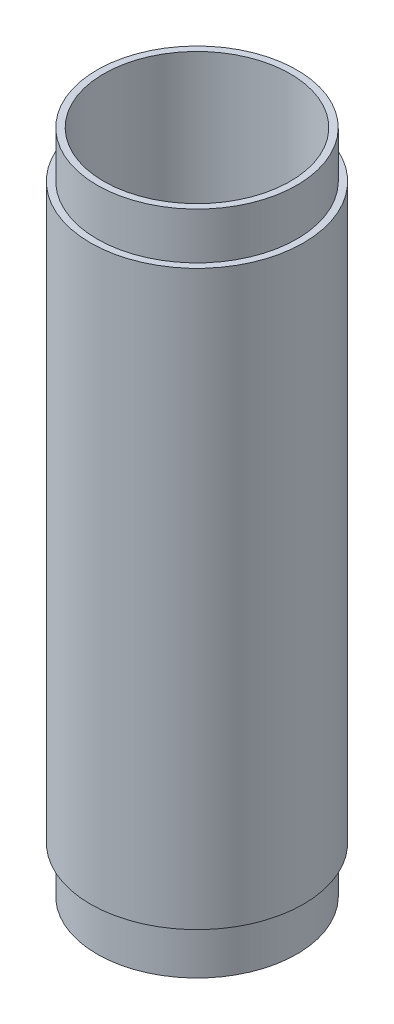
ISO-10303-21;
HEADER;
FILE_DESCRIPTION(('STEP AP214'),'2;1');
FILE_NAME('part.step','',(''),(''),'','','');
FILE_SCHEMA(('AUTOMOTIVE_DESIGN { 1 0 10303 214 1 1 1 1 }'));
ENDSEC;
DATA;
#1=APPLICATION_CONTEXT('core data for automotive mechanical design processes');
#2=APPLICATION_PROTOCOL_DEFINITION('international standard','automotive_design',2000,#1);
#3=PRODUCT_CONTEXT('',#1,'mechanical');
#4=PRODUCT('Part','Part','',(#3));
#5=PRODUCT_RELATED_PRODUCT_CATEGORY('part','',(#4));
#6=PRODUCT_DEFINITION_FORMATION('','',#4);
#7=PRODUCT_DEFINITION_CONTEXT('part definition',#1,'design');
#8=PRODUCT_DEFINITION('design','',#6,#7);
#9=PRODUCT_DEFINITION_SHAPE('','',#8);
#10=(LENGTH_UNIT() NAMED_UNIT(*) SI_UNIT(.MILLI.,.METRE.));
#11=(NAMED_UNIT(*) PLANE_ANGLE_UNIT() SI_UNIT($,.RADIAN.));
#12=(NAMED_UNIT(*) SI_UNIT($,.STERADIAN.) SOLID_ANGLE_UNIT());
#13=UNCERTAINTY_MEASURE_WITH_UNIT(LENGTH_MEASURE(1.E-05),#10,'distance_accuracy_value','');
#14=(GEOMETRIC_REPRESENTATION_CONTEXT(3) GLOBAL_UNCERTAINTY_ASSIGNED_CONTEXT((#13)) GLOBAL_UNIT_ASSIGNED_CONTEXT((#10,
#11,#12)) REPRESENTATION_CONTEXT('',''));
#15=CARTESIAN_POINT('',(0.,0.,0.));
#16=DIRECTION('',(0.,0.,1.));
#17=DIRECTION('',(1.,0.,0.));
#18=AXIS2_PLACEMENT_3D('',#15,#16,#17);
#19=CARTESIAN_POINT('',(0.,0.,0.));
#20=DIRECTION('',(0.,1.,0.));
#21=DIRECTION('',(0.,0.,1.));
#22=AXIS2_PLACEMENT_3D('',#19,#20,#21);
#23=CYLINDRICAL_SURFACE('',#22,15.);
#24=CARTESIAN_POINT('',(0.,0.,0.));
#25=DIRECTION('',(0.,1.,0.));
#26=DIRECTION('',(0.,0.,1.));
#27=AXIS2_PLACEMENT_3D('',#24,#25,#26);
#28=CIRCLE('',#27,15.);
#29=CARTESIAN_POINT('',(0.,0.,15.));
#30=VERTEX_POINT('',#29);
#31=EDGE_CURVE('E50',#30,#30,#28,.T.);
#32=ORIENTED_EDGE('',*,*,#31,.T.);
#33=EDGE_LOOP('',(#32));
#34=FACE_BOUND('',#33,.T.);
#35=CARTESIAN_POINT('',(0.,7.00000000000001,0.));
#36=DIRECTION('',(0.,1.,0.));
#37=DIRECTION('',(0.,0.,1.));
#38=AXIS2_PLACEMENT_3D('',#35,#36,#37);
#39=CIRCLE('',#38,15.);
#40=CARTESIAN_POINT('',(0.,7.00000000000001,15.));
#41=VERTEX_POINT('',#40);
#42=EDGE_CURVE('E63',#41,#41,#39,.F.);
#43=ORIENTED_EDGE('',*,*,#42,.T.);
#44=EDGE_LOOP('',(#43));
#45=FACE_BOUND('',#44,.T.);
#46=ADVANCED_FACE('F46',(#34,#45),#23,.T.);
#47=CARTESIAN_POINT('',(0.,93.,0.));
#48=DIRECTION('',(0.,1.,0.));
#49=DIRECTION('',(0.,0.,1.));
#50=AXIS2_PLACEMENT_3D('',#47,#48,#49);
#51=CIRCLE('',#50,15.);
#52=CARTESIAN_POINT('',(0.,93.,15.));
#53=VERTEX_POINT('',#52);
#54=EDGE_CURVE('E12',#53,#53,#51,.F.);
#55=ORIENTED_EDGE('',*,*,#54,.F.);
#56=EDGE_LOOP('',(#55));
#57=FACE_BOUND('',#56,.T.);
#58=CARTESIAN_POINT('',(0.,100.,0.));
#59=DIRECTION('',(0.,1.,0.));
#60=DIRECTION('',(0.,0.,1.));
#61=AXIS2_PLACEMENT_3D('',#58,#59,#60);
#62=CIRCLE('',#61,15.);
#63=CARTESIAN_POINT('',(0.,100.,15.));
#64=VERTEX_POINT('',#63);
#65=EDGE_CURVE('E69',#64,#64,#62,.T.);
#66=ORIENTED_EDGE('',*,*,#65,.F.);
#67=EDGE_LOOP('',(#66));
#68=FACE_BOUND('',#67,.T.);
#69=ADVANCED_FACE('F48',(#57,#68),#23,.T.);
#70=CARTESIAN_POINT('',(0.,0.,0.));
#71=DIRECTION('',(0.,1.,0.));
#72=DIRECTION('',(0.,0.,1.));
#73=AXIS2_PLACEMENT_3D('',#70,#71,#72);
#74=PLANE('',#73);
#75=CARTESIAN_POINT('',(0.,0.,0.));
#76=DIRECTION('',(0.,1.,0.));
#77=DIRECTION('',(0.,0.,1.));
#78=AXIS2_PLACEMENT_3D('',#75,#76,#77);
#79=CIRCLE('',#78,14.);
#80=CARTESIAN_POINT('',(0.,0.,14.));
#81=VERTEX_POINT('',#80);
#82=EDGE_CURVE('E58',#81,#81,#79,.T.);
#83=ORIENTED_EDGE('',*,*,#82,.T.);
#84=EDGE_LOOP('',(#83));
#85=FACE_BOUND('',#84,.T.);
#86=ORIENTED_EDGE('',*,*,#31,.F.);
#87=EDGE_LOOP('',(#86));
#88=FACE_BOUND('',#87,.T.);
#89=ADVANCED_FACE('F74',(#85,#88),#74,.F.);
#90=CARTESIAN_POINT('',(0.,0.,0.));
#91=DIRECTION('',(0.,1.,0.));
#92=DIRECTION('',(0.,0.,1.));
#93=AXIS2_PLACEMENT_3D('',#90,#91,#92);
#94=CYLINDRICAL_SURFACE('',#93,14.);
#95=CARTESIAN_POINT('',(0.,100.,0.));
#96=DIRECTION('',(0.,1.,0.));
#97=DIRECTION('',(0.,0.,1.));
#98=AXIS2_PLACEMENT_3D('',#95,#96,#97);
#99=CIRCLE('',#98,14.);
#100=CARTESIAN_POINT('',(0.,100.,14.));
#101=VERTEX_POINT('',#100);
#102=EDGE_CURVE('E66',#101,#101,#99,.T.);
#103=ORIENTED_EDGE('',*,*,#102,.T.);
#104=EDGE_LOOP('',(#103));
#105=FACE_BOUND('',#104,.T.);
#106=ORIENTED_EDGE('',*,*,#82,.F.);
#107=EDGE_LOOP('',(#106));
#108=FACE_BOUND('',#107,.T.);
#109=ADVANCED_FACE('F77',(#105,#108),#94,.F.);
#110=CARTESIAN_POINT('',(0.,100.,0.));
#111=DIRECTION('',(0.,1.,0.));
#112=DIRECTION('',(0.,0.,1.));
#113=AXIS2_PLACEMENT_3D('',#110,#111,#112);
#114=PLANE('',#113);
#115=ORIENTED_EDGE('',*,*,#65,.T.);
#116=EDGE_LOOP('',(#115));
#117=FACE_BOUND('',#116,.T.);
#118=ORIENTED_EDGE('',*,*,#102,.F.);
#119=EDGE_LOOP('',(#118));
#120=FACE_BOUND('',#119,.T.);
#121=ADVANCED_FACE('F79',(#117,#120),#114,.T.);
#122=CARTESIAN_POINT('',(0.,7.00000000000001,0.));
#123=DIRECTION('',(0.,1.,0.));
#124=DIRECTION('',(0.,0.,1.));
#125=AXIS2_PLACEMENT_3D('',#122,#123,#124);
#126=CYLINDRICAL_SURFACE('',#125,16.);
#127=CARTESIAN_POINT('',(0.,7.00000000000001,0.));
#128=DIRECTION('',(0.,1.,0.));
#129=DIRECTION('',(0.,0.,1.));
#130=AXIS2_PLACEMENT_3D('',#127,#128,#129);
#131=CIRCLE('',#130,16.);
#132=CARTESIAN_POINT('',(0.,7.00000000000001,16.));
#133=VERTEX_POINT('',#132);
#134=EDGE_CURVE('E61',#133,#133,#131,.T.);
#135=ORIENTED_EDGE('',*,*,#134,.T.);
#136=EDGE_LOOP('',(#135));
#137=FACE_BOUND('',#136,.T.);
#138=CARTESIAN_POINT('',(0.,93.,0.));
#139=DIRECTION('',(0.,1.,0.));
#140=DIRECTION('',(0.,0.,1.));
#141=AXIS2_PLACEMENT_3D('',#138,#139,#140);
#142=CIRCLE('',#141,16.);
#143=CARTESIAN_POINT('',(0.,93.,16.));
#144=VERTEX_POINT('',#143);
#145=EDGE_CURVE('E107',#144,#144,#142,.T.);
#146=ORIENTED_EDGE('',*,*,#145,.F.);
#147=EDGE_LOOP('',(#146));
#148=FACE_BOUND('',#147,.T.);
#149=ADVANCED_FACE('F86',(#137,#148),#126,.T.);
#150=CARTESIAN_POINT('',(0.,7.00000000000001,0.));
#151=DIRECTION('',(0.,1.,0.));
#152=DIRECTION('',(0.,0.,1.));
#153=AXIS2_PLACEMENT_3D('',#150,#151,#152);
#154=PLANE('',#153);
#155=ORIENTED_EDGE('',*,*,#42,.F.);
#156=EDGE_LOOP('',(#155));
#157=FACE_BOUND('',#156,.T.);
#158=ORIENTED_EDGE('',*,*,#134,.F.);
#159=EDGE_LOOP('',(#158));
#160=FACE_BOUND('',#159,.T.);
#161=ADVANCED_FACE('F99',(#157,#160),#154,.F.);
#162=CARTESIAN_POINT('',(0.,93.,0.));
#163=DIRECTION('',(0.,1.,0.));
#164=DIRECTION('',(0.,0.,1.));
#165=AXIS2_PLACEMENT_3D('',#162,#163,#164);
#166=PLANE('',#165);
#167=ORIENTED_EDGE('',*,*,#54,.T.);
#168=EDGE_LOOP('',(#167));
#169=FACE_BOUND('',#168,.T.);
#170=ORIENTED_EDGE('',*,*,#145,.T.);
#171=EDGE_LOOP('',(#170));
#172=FACE_BOUND('',#171,.T.);
#173=ADVANCED_FACE('F102',(#169,#172),#166,.T.);
#174=CLOSED_SHELL('',(#46,#69,#89,#109,#121,#149,#161,#173));
#175=MANIFOLD_SOLID_BREP('B2',#174);
#176=ADVANCED_BREP_SHAPE_REPRESENTATION('',(#18,#175),#14);
#177=SHAPE_DEFINITION_REPRESENTATION(#9,#176);
ENDSEC;
END-ISO-10303-21;
